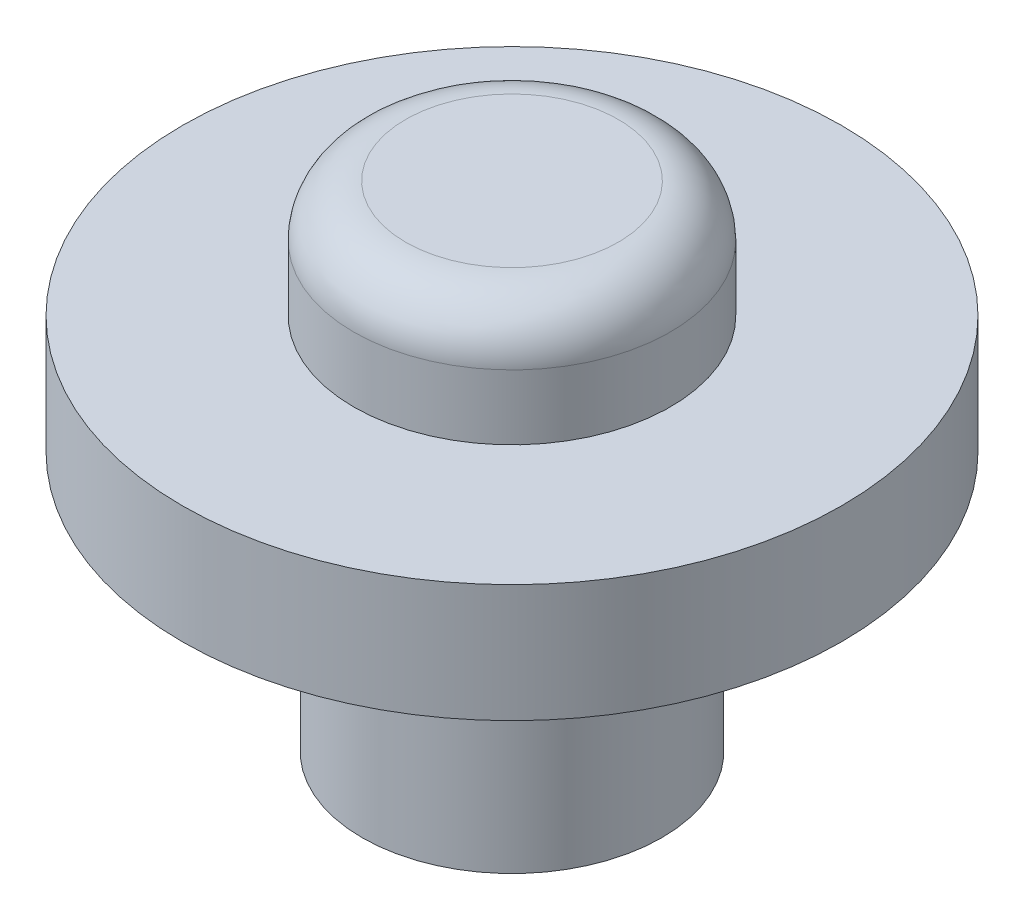
ISO-10303-21;
HEADER;
FILE_DESCRIPTION(('STEP AP214'),'2;1');
FILE_NAME('part.step','',(''),(''),'','','');
FILE_SCHEMA(('AUTOMOTIVE_DESIGN { 1 0 10303 214 1 1 1 1 }'));
ENDSEC;
DATA;
#1=APPLICATION_CONTEXT('core data for automotive mechanical design processes');
#2=APPLICATION_PROTOCOL_DEFINITION('international standard','automotive_design',2000,#1);
#3=PRODUCT_CONTEXT('',#1,'mechanical');
#4=PRODUCT('Part','Part','',(#3));
#5=PRODUCT_RELATED_PRODUCT_CATEGORY('part','',(#4));
#6=PRODUCT_DEFINITION_FORMATION('','',#4);
#7=PRODUCT_DEFINITION_CONTEXT('part definition',#1,'design');
#8=PRODUCT_DEFINITION('design','',#6,#7);
#9=PRODUCT_DEFINITION_SHAPE('','',#8);
#10=(LENGTH_UNIT() NAMED_UNIT(*) SI_UNIT(.MILLI.,.METRE.));
#11=(NAMED_UNIT(*) PLANE_ANGLE_UNIT() SI_UNIT($,.RADIAN.));
#12=(NAMED_UNIT(*) SI_UNIT($,.STERADIAN.) SOLID_ANGLE_UNIT());
#13=UNCERTAINTY_MEASURE_WITH_UNIT(LENGTH_MEASURE(1.E-05),#10,'distance_accuracy_value','');
#14=(GEOMETRIC_REPRESENTATION_CONTEXT(3) GLOBAL_UNCERTAINTY_ASSIGNED_CONTEXT((#13)) GLOBAL_UNIT_ASSIGNED_CONTEXT((#10,
#11,#12)) REPRESENTATION_CONTEXT('',''));
#15=CARTESIAN_POINT('',(0.,0.,0.));
#16=DIRECTION('',(0.,0.,1.));
#17=DIRECTION('',(1.,0.,0.));
#18=AXIS2_PLACEMENT_3D('',#15,#16,#17);
#19=CARTESIAN_POINT('',(0.,-10.,0.));
#20=DIRECTION('',(0.,1.,0.));
#21=DIRECTION('',(0.,0.,1.));
#22=AXIS2_PLACEMENT_3D('',#19,#20,#21);
#23=CYLINDRICAL_SURFACE('',#22,5.775);
#24=CARTESIAN_POINT('',(0.,-10.,0.));
#25=DIRECTION('',(0.,1.,0.));
#26=DIRECTION('',(0.,0.,1.));
#27=AXIS2_PLACEMENT_3D('',#24,#25,#26);
#28=CIRCLE('',#27,5.775);
#29=CARTESIAN_POINT('',(0.,-10.,5.775));
#30=VERTEX_POINT('',#29);
#31=EDGE_CURVE('E47',#30,#30,#28,.T.);
#32=ORIENTED_EDGE('',*,*,#31,.T.);
#33=EDGE_LOOP('',(#32));
#34=FACE_BOUND('',#33,.T.);
#35=CARTESIAN_POINT('',(0.,0.,0.));
#36=DIRECTION('',(0.,1.,0.));
#37=DIRECTION('',(0.,0.,1.));
#38=AXIS2_PLACEMENT_3D('',#35,#36,#37);
#39=CIRCLE('',#38,5.775);
#40=CARTESIAN_POINT('',(0.,0.,5.775));
#41=VERTEX_POINT('',#40);
#42=EDGE_CURVE('E50',#41,#41,#39,.T.);
#43=ORIENTED_EDGE('',*,*,#42,.F.);
#44=EDGE_LOOP('',(#43));
#45=FACE_BOUND('',#44,.T.);
#46=ADVANCED_FACE('F32',(#34,#45),#23,.T.);
#47=CARTESIAN_POINT('',(0.,-10.,0.));
#48=DIRECTION('',(0.,1.,0.));
#49=DIRECTION('',(0.,0.,1.));
#50=AXIS2_PLACEMENT_3D('',#47,#48,#49);
#51=PLANE('',#50);
#52=ORIENTED_EDGE('',*,*,#31,.F.);
#53=EDGE_LOOP('',(#52));
#54=FACE_BOUND('',#53,.T.);
#55=ADVANCED_FACE('F67',(#54),#51,.F.);
#56=CARTESIAN_POINT('',(0.,4.54,0.));
#57=DIRECTION('',(0.,-1.,0.));
#58=DIRECTION('',(0.,0.,-1.));
#59=AXIS2_PLACEMENT_3D('',#56,#57,#58);
#60=CYLINDRICAL_SURFACE('',#59,12.7);
#61=CARTESIAN_POINT('',(0.,4.54,0.));
#62=DIRECTION('',(0.,1.,0.));
#63=DIRECTION('',(0.,0.,1.));
#64=AXIS2_PLACEMENT_3D('',#61,#62,#63);
#65=CIRCLE('',#64,12.7);
#66=CARTESIAN_POINT('',(0.,4.54,12.7));
#67=VERTEX_POINT('',#66);
#68=EDGE_CURVE('E53',#67,#67,#65,.T.);
#69=ORIENTED_EDGE('',*,*,#68,.F.);
#70=EDGE_LOOP('',(#69));
#71=FACE_BOUND('',#70,.T.);
#72=CARTESIAN_POINT('',(0.,0.,0.));
#73=DIRECTION('',(0.,1.,0.));
#74=DIRECTION('',(0.,0.,1.));
#75=AXIS2_PLACEMENT_3D('',#72,#73,#74);
#76=CIRCLE('',#75,12.7);
#77=CARTESIAN_POINT('',(0.,0.,12.7));
#78=VERTEX_POINT('',#77);
#79=EDGE_CURVE('E56',#78,#78,#76,.T.);
#80=ORIENTED_EDGE('',*,*,#79,.T.);
#81=EDGE_LOOP('',(#80));
#82=FACE_BOUND('',#81,.T.);
#83=ADVANCED_FACE('F64',(#71,#82),#60,.T.);
#84=CARTESIAN_POINT('',(0.,4.54,0.));
#85=DIRECTION('',(0.,1.,0.));
#86=DIRECTION('',(0.,0.,1.));
#87=AXIS2_PLACEMENT_3D('',#84,#85,#86);
#88=PLANE('',#87);
#89=CARTESIAN_POINT('',(0.,4.54,0.));
#90=DIRECTION('',(0.,1.,0.));
#91=DIRECTION('',(0.,0.,1.));
#92=AXIS2_PLACEMENT_3D('',#89,#90,#91);
#93=CIRCLE('',#92,6.1);
#94=CARTESIAN_POINT('',(0.,4.54,6.1));
#95=VERTEX_POINT('',#94);
#96=EDGE_CURVE('E43',#95,#95,#93,.T.);
#97=ORIENTED_EDGE('',*,*,#96,.F.);
#98=EDGE_LOOP('',(#97));
#99=FACE_BOUND('',#98,.T.);
#100=ORIENTED_EDGE('',*,*,#68,.T.);
#101=EDGE_LOOP('',(#100));
#102=FACE_BOUND('',#101,.T.);
#103=ADVANCED_FACE('F62',(#99,#102),#88,.T.);
#104=CARTESIAN_POINT('',(0.,0.,0.));
#105=DIRECTION('',(0.,1.,0.));
#106=DIRECTION('',(0.,0.,1.));
#107=AXIS2_PLACEMENT_3D('',#104,#105,#106);
#108=PLANE('',#107);
#109=ORIENTED_EDGE('',*,*,#42,.T.);
#110=EDGE_LOOP('',(#109));
#111=FACE_BOUND('',#110,.T.);
#112=ORIENTED_EDGE('',*,*,#79,.F.);
#113=EDGE_LOOP('',(#112));
#114=FACE_BOUND('',#113,.T.);
#115=ADVANCED_FACE('F71',(#111,#114),#108,.F.);
#116=CARTESIAN_POINT('',(0.,9.04,0.));
#117=DIRECTION('',(0.,-1.,0.));
#118=DIRECTION('',(0.,0.,-1.));
#119=AXIS2_PLACEMENT_3D('',#116,#117,#118);
#120=CYLINDRICAL_SURFACE('',#119,6.1);
#121=CARTESIAN_POINT('',(0.,7.04,0.));
#122=DIRECTION('',(0.,1.,0.));
#123=DIRECTION('',(0.,0.,1.));
#124=AXIS2_PLACEMENT_3D('',#121,#122,#123);
#125=CIRCLE('',#124,6.1);
#126=CARTESIAN_POINT('',(0.,7.04,6.1));
#127=VERTEX_POINT('',#126);
#128=EDGE_CURVE('E10',#127,#127,#125,.F.);
#129=ORIENTED_EDGE('',*,*,#128,.T.);
#130=EDGE_LOOP('',(#129));
#131=FACE_BOUND('',#130,.T.);
#132=ORIENTED_EDGE('',*,*,#96,.T.);
#133=EDGE_LOOP('',(#132));
#134=FACE_BOUND('',#133,.T.);
#135=ADVANCED_FACE('F73',(#131,#134),#120,.T.);
#136=CARTESIAN_POINT('',(0.,9.04,0.));
#137=DIRECTION('',(0.,1.,0.));
#138=DIRECTION('',(0.,0.,1.));
#139=AXIS2_PLACEMENT_3D('',#136,#137,#138);
#140=PLANE('',#139);
#141=CARTESIAN_POINT('',(0.,9.04,0.));
#142=DIRECTION('',(0.,1.,0.));
#143=DIRECTION('',(0.,0.,1.));
#144=AXIS2_PLACEMENT_3D('',#141,#142,#143);
#145=CIRCLE('',#144,4.1);
#146=CARTESIAN_POINT('',(0.,9.04,4.1));
#147=VERTEX_POINT('',#146);
#148=EDGE_CURVE('E39',#147,#147,#145,.T.);
#149=ORIENTED_EDGE('',*,*,#148,.T.);
#150=EDGE_LOOP('',(#149));
#151=FACE_BOUND('',#150,.T.);
#152=ADVANCED_FACE('F80',(#151),#140,.T.);
#153=CARTESIAN_POINT('',(0.,7.04,0.));
#154=DIRECTION('',(0.,1.,0.));
#155=DIRECTION('',(0.,0.,1.));
#156=AXIS2_PLACEMENT_3D('',#153,#154,#155);
#157=TOROIDAL_SURFACE('',#156,4.1,2.);
#158=ORIENTED_EDGE('',*,*,#128,.F.);
#159=EDGE_LOOP('',(#158));
#160=FACE_BOUND('',#159,.T.);
#161=ORIENTED_EDGE('',*,*,#148,.F.);
#162=EDGE_LOOP('',(#161));
#163=FACE_BOUND('',#162,.T.);
#164=ADVANCED_FACE('F34',(#160,#163),#157,.T.);
#165=CLOSED_SHELL('',(#46,#55,#83,#103,#115,#135,#152,#164));
#166=MANIFOLD_SOLID_BREP('B2',#165);
#167=ADVANCED_BREP_SHAPE_REPRESENTATION('',(#18,#166),#14);
#168=SHAPE_DEFINITION_REPRESENTATION(#9,#167);
ENDSEC;
END-ISO-10303-21;
